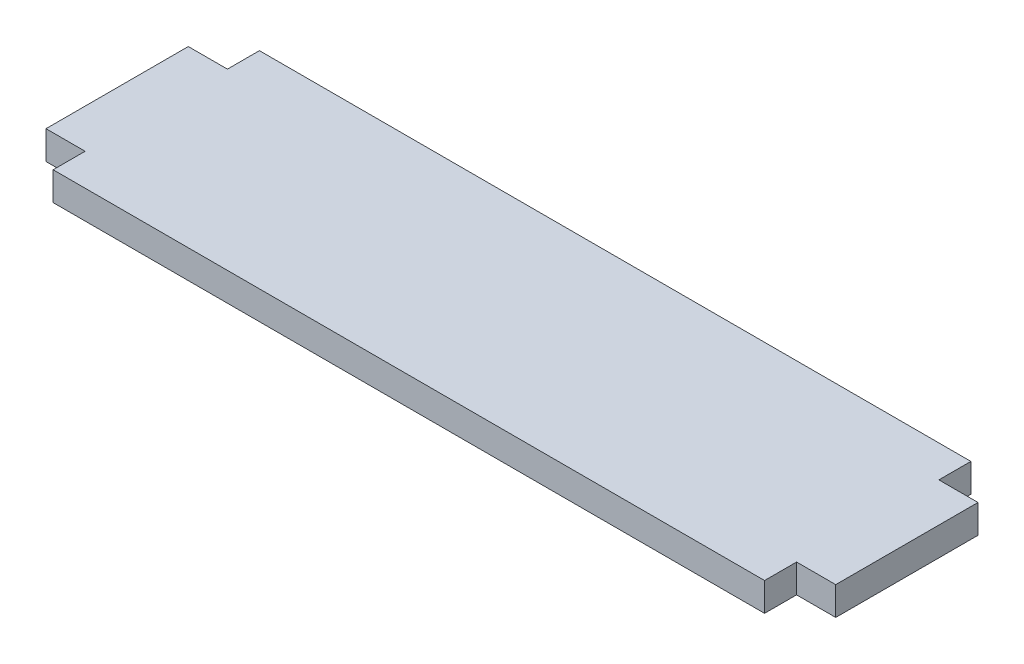
ISO-10303-21;
HEADER;
FILE_DESCRIPTION(('STEP AP214'),'2;1');
FILE_NAME('part.step','',(''),(''),'','','');
FILE_SCHEMA(('AUTOMOTIVE_DESIGN { 1 0 10303 214 1 1 1 1 }'));
ENDSEC;
DATA;
#1=APPLICATION_CONTEXT('core data for automotive mechanical design processes');
#2=APPLICATION_PROTOCOL_DEFINITION('international standard','automotive_design',2000,#1);
#3=PRODUCT_CONTEXT('',#1,'mechanical');
#4=PRODUCT('Part','Part','',(#3));
#5=PRODUCT_RELATED_PRODUCT_CATEGORY('part','',(#4));
#6=PRODUCT_DEFINITION_FORMATION('','',#4);
#7=PRODUCT_DEFINITION_CONTEXT('part definition',#1,'design');
#8=PRODUCT_DEFINITION('design','',#6,#7);
#9=PRODUCT_DEFINITION_SHAPE('','',#8);
#10=(LENGTH_UNIT() NAMED_UNIT(*) SI_UNIT(.MILLI.,.METRE.));
#11=(NAMED_UNIT(*) PLANE_ANGLE_UNIT() SI_UNIT($,.RADIAN.));
#12=(NAMED_UNIT(*) SI_UNIT($,.STERADIAN.) SOLID_ANGLE_UNIT());
#13=UNCERTAINTY_MEASURE_WITH_UNIT(LENGTH_MEASURE(1.E-05),#10,'distance_accuracy_value','');
#14=(GEOMETRIC_REPRESENTATION_CONTEXT(3) GLOBAL_UNCERTAINTY_ASSIGNED_CONTEXT((#13)) GLOBAL_UNIT_ASSIGNED_CONTEXT((#10,
#11,#12)) REPRESENTATION_CONTEXT('',''));
#15=CARTESIAN_POINT('',(0.,0.,0.));
#16=DIRECTION('',(0.,0.,1.));
#17=DIRECTION('',(1.,0.,0.));
#18=AXIS2_PLACEMENT_3D('',#15,#16,#17);
#19=CARTESIAN_POINT('',(-49.9999888700121,4.,14.4984944243489));
#20=DIRECTION('',(1.,0.,0.));
#21=DIRECTION('',(0.,0.,-1.));
#22=AXIS2_PLACEMENT_3D('',#19,#20,#21);
#23=PLANE('',#22);
#24=DIRECTION('',(0.,0.,1.));
#25=VECTOR('',#24,1.);
#26=CARTESIAN_POINT('',(-49.9999888700121,0.,14.4984944243489));
#27=LINE('',#26,#25);
#28=CARTESIAN_POINT('',(-49.9999888700121,0.,-14.4984944243489));
#29=VERTEX_POINT('',#28);
#30=CARTESIAN_POINT('',(-49.9999888700121,0.,-10.));
#31=VERTEX_POINT('',#30);
#32=EDGE_CURVE('E207',#29,#31,#27,.T.);
#33=ORIENTED_EDGE('',*,*,#32,.T.);
#34=DIRECTION('',(0.,1.,0.));
#35=VECTOR('',#34,1.);
#36=CARTESIAN_POINT('',(-49.9999888700121,4.,-10.));
#37=LINE('',#36,#35);
#38=CARTESIAN_POINT('',(-49.9999888700121,4.,-10.));
#39=VERTEX_POINT('',#38);
#40=EDGE_CURVE('E133',#31,#39,#37,.T.);
#41=ORIENTED_EDGE('',*,*,#40,.T.);
#42=DIRECTION('',(0.,0.,1.));
#43=VECTOR('',#42,1.);
#44=CARTESIAN_POINT('',(-49.9999888700121,4.,14.4984944243489));
#45=LINE('',#44,#43);
#46=CARTESIAN_POINT('',(-49.9999888700121,4.,-14.4984944243489));
#47=VERTEX_POINT('',#46);
#48=EDGE_CURVE('E177',#47,#39,#45,.T.);
#49=ORIENTED_EDGE('',*,*,#48,.F.);
#50=DIRECTION('',(0.,-1.,0.));
#51=VECTOR('',#50,1.);
#52=CARTESIAN_POINT('',(-49.9999888700121,4.,-14.4984944243489));
#53=LINE('',#52,#51);
#54=EDGE_CURVE('E44',#47,#29,#53,.T.);
#55=ORIENTED_EDGE('',*,*,#54,.T.);
#56=EDGE_LOOP('',(#33,#41,#49,#55));
#57=FACE_BOUND('',#56,.T.);
#58=ADVANCED_FACE('F35',(#57),#23,.F.);
#59=CARTESIAN_POINT('',(49.9999888700121,4.,14.4984944243489));
#60=DIRECTION('',(-1.,0.,0.));
#61=DIRECTION('',(0.,0.,1.));
#62=AXIS2_PLACEMENT_3D('',#59,#60,#61);
#63=PLANE('',#62);
#64=DIRECTION('',(0.,1.,0.));
#65=VECTOR('',#64,1.);
#66=CARTESIAN_POINT('',(49.9999888700121,4.,-10.));
#67=LINE('',#66,#65);
#68=CARTESIAN_POINT('',(49.9999888700121,0.,-10.));
#69=VERTEX_POINT('',#68);
#70=CARTESIAN_POINT('',(49.9999888700121,4.,-10.));
#71=VERTEX_POINT('',#70);
#72=EDGE_CURVE('E138',#69,#71,#67,.T.);
#73=ORIENTED_EDGE('',*,*,#72,.F.);
#74=DIRECTION('',(0.,0.,-1.));
#75=VECTOR('',#74,1.);
#76=CARTESIAN_POINT('',(49.9999888700121,0.,14.4984944243489));
#77=LINE('',#76,#75);
#78=CARTESIAN_POINT('',(49.9999888700121,0.,-14.4984944243489));
#79=VERTEX_POINT('',#78);
#80=EDGE_CURVE('E194',#69,#79,#77,.T.);
#81=ORIENTED_EDGE('',*,*,#80,.T.);
#82=DIRECTION('',(0.,-1.,0.));
#83=VECTOR('',#82,1.);
#84=CARTESIAN_POINT('',(49.9999888700121,4.,-14.4984944243489));
#85=LINE('',#84,#83);
#86=CARTESIAN_POINT('',(49.9999888700121,4.,-14.4984944243489));
#87=VERTEX_POINT('',#86);
#88=EDGE_CURVE('E11',#87,#79,#85,.T.);
#89=ORIENTED_EDGE('',*,*,#88,.F.);
#90=DIRECTION('',(0.,0.,-1.));
#91=VECTOR('',#90,1.);
#92=CARTESIAN_POINT('',(49.9999888700121,4.,14.4984944243489));
#93=LINE('',#92,#91);
#94=EDGE_CURVE('E60',#71,#87,#93,.T.);
#95=ORIENTED_EDGE('',*,*,#94,.F.);
#96=EDGE_LOOP('',(#73,#81,#89,#95));
#97=FACE_BOUND('',#96,.T.);
#98=ADVANCED_FACE('F37',(#97),#63,.F.);
#99=DIRECTION('',(0.,-1.,0.));
#100=VECTOR('',#99,1.);
#101=CARTESIAN_POINT('',(49.9999888700121,4.,9.99999999999999));
#102=LINE('',#101,#100);
#103=CARTESIAN_POINT('',(49.9999888700121,4.,9.99999999999999));
#104=VERTEX_POINT('',#103);
#105=CARTESIAN_POINT('',(49.9999888700121,0.,9.99999999999999));
#106=VERTEX_POINT('',#105);
#107=EDGE_CURVE('E223',#104,#106,#102,.T.);
#108=ORIENTED_EDGE('',*,*,#107,.F.);
#109=CARTESIAN_POINT('',(49.9999888700121,4.,14.4984944243489));
#110=VERTEX_POINT('',#109);
#111=EDGE_CURVE('E257',#110,#104,#93,.T.);
#112=ORIENTED_EDGE('',*,*,#111,.F.);
#113=DIRECTION('',(0.,-1.,0.));
#114=VECTOR('',#113,1.);
#115=CARTESIAN_POINT('',(49.9999888700121,4.,14.4984944243489));
#116=LINE('',#115,#114);
#117=CARTESIAN_POINT('',(49.9999888700121,0.,14.4984944243489));
#118=VERTEX_POINT('',#117);
#119=EDGE_CURVE('E187',#110,#118,#116,.T.);
#120=ORIENTED_EDGE('',*,*,#119,.T.);
#121=EDGE_CURVE('E197',#118,#106,#77,.T.);
#122=ORIENTED_EDGE('',*,*,#121,.T.);
#123=EDGE_LOOP('',(#108,#112,#120,#122));
#124=FACE_BOUND('',#123,.T.);
#125=ADVANCED_FACE('F281',(#124),#63,.F.);
#126=CARTESIAN_POINT('',(-49.9999888700121,4.,-14.4984944243489));
#127=DIRECTION('',(0.,0.,1.));
#128=DIRECTION('',(1.,0.,0.));
#129=AXIS2_PLACEMENT_3D('',#126,#127,#128);
#130=PLANE('',#129);
#131=DIRECTION('',(-1.,0.,0.));
#132=VECTOR('',#131,1.);
#133=CARTESIAN_POINT('',(-49.9999888700121,0.,-14.4984944243489));
#134=LINE('',#133,#132);
#135=EDGE_CURVE('E190',#79,#29,#134,.T.);
#136=ORIENTED_EDGE('',*,*,#135,.T.);
#137=ORIENTED_EDGE('',*,*,#54,.F.);
#138=DIRECTION('',(-1.,0.,0.));
#139=VECTOR('',#138,1.);
#140=CARTESIAN_POINT('',(-49.9999888700121,4.,-14.4984944243489));
#141=LINE('',#140,#139);
#142=EDGE_CURVE('E178',#87,#47,#141,.T.);
#143=ORIENTED_EDGE('',*,*,#142,.F.);
#144=ORIENTED_EDGE('',*,*,#88,.T.);
#145=EDGE_LOOP('',(#136,#137,#143,#144));
#146=FACE_BOUND('',#145,.T.);
#147=ADVANCED_FACE('F254',(#146),#130,.F.);
#148=CARTESIAN_POINT('',(-49.9999888700121,4.,9.99999999999999));
#149=VERTEX_POINT('',#148);
#150=CARTESIAN_POINT('',(-49.9999888700121,4.,14.4984944243489));
#151=VERTEX_POINT('',#150);
#152=EDGE_CURVE('E174',#149,#151,#45,.T.);
#153=ORIENTED_EDGE('',*,*,#152,.F.);
#154=DIRECTION('',(0.,-1.,0.));
#155=VECTOR('',#154,1.);
#156=CARTESIAN_POINT('',(-49.9999888700121,4.,9.99999999999999));
#157=LINE('',#156,#155);
#158=CARTESIAN_POINT('',(-49.9999888700121,0.,9.99999999999999));
#159=VERTEX_POINT('',#158);
#160=EDGE_CURVE('E146',#149,#159,#157,.T.);
#161=ORIENTED_EDGE('',*,*,#160,.T.);
#162=CARTESIAN_POINT('',(-49.9999888700121,0.,14.4984944243489));
#163=VERTEX_POINT('',#162);
#164=EDGE_CURVE('E210',#159,#163,#27,.T.);
#165=ORIENTED_EDGE('',*,*,#164,.T.);
#166=DIRECTION('',(0.,-1.,0.));
#167=VECTOR('',#166,1.);
#168=CARTESIAN_POINT('',(-49.9999888700121,4.,14.4984944243489));
#169=LINE('',#168,#167);
#170=EDGE_CURVE('E201',#151,#163,#169,.T.);
#171=ORIENTED_EDGE('',*,*,#170,.F.);
#172=EDGE_LOOP('',(#153,#161,#165,#171));
#173=FACE_BOUND('',#172,.T.);
#174=ADVANCED_FACE('F271',(#173),#23,.F.);
#175=CARTESIAN_POINT('',(-49.9999888700121,4.,14.4984944243489));
#176=DIRECTION('',(0.,0.,-1.));
#177=DIRECTION('',(-1.,0.,0.));
#178=AXIS2_PLACEMENT_3D('',#175,#176,#177);
#179=PLANE('',#178);
#180=DIRECTION('',(1.,0.,0.));
#181=VECTOR('',#180,1.);
#182=CARTESIAN_POINT('',(-49.9999888700121,0.,14.4984944243489));
#183=LINE('',#182,#181);
#184=EDGE_CURVE('E206',#163,#118,#183,.T.);
#185=ORIENTED_EDGE('',*,*,#184,.T.);
#186=ORIENTED_EDGE('',*,*,#119,.F.);
#187=DIRECTION('',(1.,0.,0.));
#188=VECTOR('',#187,1.);
#189=CARTESIAN_POINT('',(-49.9999888700121,4.,14.4984944243489));
#190=LINE('',#189,#188);
#191=EDGE_CURVE('E184',#151,#110,#190,.T.);
#192=ORIENTED_EDGE('',*,*,#191,.F.);
#193=ORIENTED_EDGE('',*,*,#170,.T.);
#194=EDGE_LOOP('',(#185,#186,#192,#193));
#195=FACE_BOUND('',#194,.T.);
#196=ADVANCED_FACE('F263',(#195),#179,.F.);
#197=CARTESIAN_POINT('',(0.,4.,0.));
#198=DIRECTION('',(0.,-1.,0.));
#199=DIRECTION('',(0.,0.,-1.));
#200=AXIS2_PLACEMENT_3D('',#197,#198,#199);
#201=PLANE('',#200);
#202=ORIENTED_EDGE('',*,*,#111,.T.);
#203=DIRECTION('',(-1.,0.,0.));
#204=VECTOR('',#203,1.);
#205=CARTESIAN_POINT('',(55.4999888700121,4.,9.99999999999999));
#206=LINE('',#205,#204);
#207=CARTESIAN_POINT('',(55.4999888700121,4.,9.99999999999999));
#208=VERTEX_POINT('',#207);
#209=EDGE_CURVE('E239',#208,#104,#206,.T.);
#210=ORIENTED_EDGE('',*,*,#209,.F.);
#211=DIRECTION('',(0.,0.,1.));
#212=VECTOR('',#211,1.);
#213=CARTESIAN_POINT('',(55.4999888700121,4.,9.99999999999999));
#214=LINE('',#213,#212);
#215=CARTESIAN_POINT('',(55.4999888700121,4.,-10.));
#216=VERTEX_POINT('',#215);
#217=EDGE_CURVE('E317',#216,#208,#214,.T.);
#218=ORIENTED_EDGE('',*,*,#217,.F.);
#219=DIRECTION('',(-1.,0.,0.));
#220=VECTOR('',#219,1.);
#221=CARTESIAN_POINT('',(55.4999888700121,4.,-10.));
#222=LINE('',#221,#220);
#223=EDGE_CURVE('E244',#216,#71,#222,.T.);
#224=ORIENTED_EDGE('',*,*,#223,.T.);
#225=ORIENTED_EDGE('',*,*,#94,.T.);
#226=ORIENTED_EDGE('',*,*,#142,.T.);
#227=ORIENTED_EDGE('',*,*,#48,.T.);
#228=DIRECTION('',(1.,0.,0.));
#229=VECTOR('',#228,1.);
#230=CARTESIAN_POINT('',(-55.4999888700121,4.,-10.));
#231=LINE('',#230,#229);
#232=CARTESIAN_POINT('',(-55.4999888700121,4.,-10.));
#233=VERTEX_POINT('',#232);
#234=EDGE_CURVE('E156',#233,#39,#231,.T.);
#235=ORIENTED_EDGE('',*,*,#234,.F.);
#236=DIRECTION('',(0.,0.,1.));
#237=VECTOR('',#236,1.);
#238=CARTESIAN_POINT('',(-55.4999888700121,4.,9.99999999999999));
#239=LINE('',#238,#237);
#240=CARTESIAN_POINT('',(-55.4999888700121,4.,9.99999999999999));
#241=VERTEX_POINT('',#240);
#242=EDGE_CURVE('E145',#233,#241,#239,.T.);
#243=ORIENTED_EDGE('',*,*,#242,.T.);
#244=DIRECTION('',(1.,0.,0.));
#245=VECTOR('',#244,1.);
#246=CARTESIAN_POINT('',(-55.4999888700121,4.,9.99999999999999));
#247=LINE('',#246,#245);
#248=EDGE_CURVE('E166',#241,#149,#247,.T.);
#249=ORIENTED_EDGE('',*,*,#248,.T.);
#250=ORIENTED_EDGE('',*,*,#152,.T.);
#251=ORIENTED_EDGE('',*,*,#191,.T.);
#252=EDGE_LOOP('',(#202,#210,#218,#224,#225,#226,#227,#235,#243,#249,#250,#251));
#253=FACE_BOUND('',#252,.T.);
#254=ADVANCED_FACE('F261',(#253),#201,.F.);
#255=CARTESIAN_POINT('',(0.,0.,0.));
#256=DIRECTION('',(0.,-1.,0.));
#257=DIRECTION('',(0.,0.,-1.));
#258=AXIS2_PLACEMENT_3D('',#255,#256,#257);
#259=PLANE('',#258);
#260=ORIENTED_EDGE('',*,*,#121,.F.);
#261=ORIENTED_EDGE('',*,*,#184,.F.);
#262=ORIENTED_EDGE('',*,*,#164,.F.);
#263=DIRECTION('',(1.,0.,0.));
#264=VECTOR('',#263,1.);
#265=CARTESIAN_POINT('',(-55.4999888700121,0.,9.99999999999999));
#266=LINE('',#265,#264);
#267=CARTESIAN_POINT('',(-55.4999888700121,0.,9.99999999999999));
#268=VERTEX_POINT('',#267);
#269=EDGE_CURVE('E52',#268,#159,#266,.T.);
#270=ORIENTED_EDGE('',*,*,#269,.F.);
#271=DIRECTION('',(0.,0.,-1.));
#272=VECTOR('',#271,1.);
#273=CARTESIAN_POINT('',(-55.4999888700121,0.,9.99999999999999));
#274=LINE('',#273,#272);
#275=CARTESIAN_POINT('',(-55.4999888700121,0.,-10.));
#276=VERTEX_POINT('',#275);
#277=EDGE_CURVE('E143',#268,#276,#274,.T.);
#278=ORIENTED_EDGE('',*,*,#277,.T.);
#279=DIRECTION('',(1.,0.,0.));
#280=VECTOR('',#279,1.);
#281=CARTESIAN_POINT('',(-55.4999888700121,0.,-10.));
#282=LINE('',#281,#280);
#283=EDGE_CURVE('E127',#276,#31,#282,.T.);
#284=ORIENTED_EDGE('',*,*,#283,.T.);
#285=ORIENTED_EDGE('',*,*,#32,.F.);
#286=ORIENTED_EDGE('',*,*,#135,.F.);
#287=ORIENTED_EDGE('',*,*,#80,.F.);
#288=DIRECTION('',(-1.,0.,0.));
#289=VECTOR('',#288,1.);
#290=CARTESIAN_POINT('',(55.4999888700121,0.,-10.));
#291=LINE('',#290,#289);
#292=CARTESIAN_POINT('',(55.4999888700121,0.,-10.));
#293=VERTEX_POINT('',#292);
#294=EDGE_CURVE('E215',#293,#69,#291,.T.);
#295=ORIENTED_EDGE('',*,*,#294,.F.);
#296=DIRECTION('',(0.,0.,-1.));
#297=VECTOR('',#296,1.);
#298=CARTESIAN_POINT('',(55.4999888700121,0.,9.99999999999999));
#299=LINE('',#298,#297);
#300=CARTESIAN_POINT('',(55.4999888700121,0.,9.99999999999999));
#301=VERTEX_POINT('',#300);
#302=EDGE_CURVE('E219',#301,#293,#299,.T.);
#303=ORIENTED_EDGE('',*,*,#302,.F.);
#304=DIRECTION('',(-1.,0.,0.));
#305=VECTOR('',#304,1.);
#306=CARTESIAN_POINT('',(55.4999888700121,0.,9.99999999999999));
#307=LINE('',#306,#305);
#308=EDGE_CURVE('E218',#301,#106,#307,.T.);
#309=ORIENTED_EDGE('',*,*,#308,.T.);
#310=EDGE_LOOP('',(#260,#261,#262,#270,#278,#284,#285,#286,#287,#295,#303,#309));
#311=FACE_BOUND('',#310,.T.);
#312=ADVANCED_FACE('F149',(#311),#259,.T.);
#313=CARTESIAN_POINT('',(55.4999888700121,4.,-10.));
#314=DIRECTION('',(0.,0.,1.));
#315=DIRECTION('',(1.,0.,0.));
#316=AXIS2_PLACEMENT_3D('',#313,#314,#315);
#317=PLANE('',#316);
#318=ORIENTED_EDGE('',*,*,#72,.T.);
#319=ORIENTED_EDGE('',*,*,#223,.F.);
#320=DIRECTION('',(0.,1.,0.));
#321=VECTOR('',#320,1.);
#322=CARTESIAN_POINT('',(55.4999888700121,4.,-10.));
#323=LINE('',#322,#321);
#324=EDGE_CURVE('E236',#293,#216,#323,.T.);
#325=ORIENTED_EDGE('',*,*,#324,.F.);
#326=ORIENTED_EDGE('',*,*,#294,.T.);
#327=EDGE_LOOP('',(#318,#319,#325,#326));
#328=FACE_BOUND('',#327,.T.);
#329=ADVANCED_FACE('F269',(#328),#317,.F.);
#330=CARTESIAN_POINT('',(55.4999888700121,4.,9.99999999999999));
#331=DIRECTION('',(0.,0.,-1.));
#332=DIRECTION('',(-1.,0.,0.));
#333=AXIS2_PLACEMENT_3D('',#330,#331,#332);
#334=PLANE('',#333);
#335=ORIENTED_EDGE('',*,*,#107,.T.);
#336=ORIENTED_EDGE('',*,*,#308,.F.);
#337=DIRECTION('',(0.,-1.,0.));
#338=VECTOR('',#337,1.);
#339=CARTESIAN_POINT('',(55.4999888700121,4.,9.99999999999999));
#340=LINE('',#339,#338);
#341=EDGE_CURVE('E316',#208,#301,#340,.T.);
#342=ORIENTED_EDGE('',*,*,#341,.F.);
#343=ORIENTED_EDGE('',*,*,#209,.T.);
#344=EDGE_LOOP('',(#335,#336,#342,#343));
#345=FACE_BOUND('',#344,.T.);
#346=ADVANCED_FACE('F304',(#345),#334,.F.);
#347=CARTESIAN_POINT('',(55.4999888700121,0.,0.));
#348=DIRECTION('',(1.,0.,0.));
#349=DIRECTION('',(0.,0.,-1.));
#350=AXIS2_PLACEMENT_3D('',#347,#348,#349);
#351=PLANE('',#350);
#352=ORIENTED_EDGE('',*,*,#324,.T.);
#353=ORIENTED_EDGE('',*,*,#217,.T.);
#354=ORIENTED_EDGE('',*,*,#341,.T.);
#355=ORIENTED_EDGE('',*,*,#302,.T.);
#356=EDGE_LOOP('',(#352,#353,#354,#355));
#357=FACE_BOUND('',#356,.T.);
#358=ADVANCED_FACE('F299',(#357),#351,.T.);
#359=CARTESIAN_POINT('',(-55.4999888700121,4.,-10.));
#360=DIRECTION('',(0.,0.,-1.));
#361=DIRECTION('',(-1.,0.,0.));
#362=AXIS2_PLACEMENT_3D('',#359,#360,#361);
#363=PLANE('',#362);
#364=ORIENTED_EDGE('',*,*,#40,.F.);
#365=ORIENTED_EDGE('',*,*,#283,.F.);
#366=DIRECTION('',(0.,1.,0.));
#367=VECTOR('',#366,1.);
#368=CARTESIAN_POINT('',(-55.4999888700121,4.,-10.));
#369=LINE('',#368,#367);
#370=EDGE_CURVE('E130',#276,#233,#369,.T.);
#371=ORIENTED_EDGE('',*,*,#370,.T.);
#372=ORIENTED_EDGE('',*,*,#234,.T.);
#373=EDGE_LOOP('',(#364,#365,#371,#372));
#374=FACE_BOUND('',#373,.T.);
#375=ADVANCED_FACE('F129',(#374),#363,.T.);
#376=CARTESIAN_POINT('',(-55.4999888700121,4.,9.99999999999999));
#377=DIRECTION('',(0.,0.,1.));
#378=DIRECTION('',(1.,0.,0.));
#379=AXIS2_PLACEMENT_3D('',#376,#377,#378);
#380=PLANE('',#379);
#381=ORIENTED_EDGE('',*,*,#160,.F.);
#382=ORIENTED_EDGE('',*,*,#248,.F.);
#383=DIRECTION('',(0.,-1.,0.));
#384=VECTOR('',#383,1.);
#385=CARTESIAN_POINT('',(-55.4999888700121,4.,9.99999999999999));
#386=LINE('',#385,#384);
#387=EDGE_CURVE('E151',#241,#268,#386,.T.);
#388=ORIENTED_EDGE('',*,*,#387,.T.);
#389=ORIENTED_EDGE('',*,*,#269,.T.);
#390=EDGE_LOOP('',(#381,#382,#388,#389));
#391=FACE_BOUND('',#390,.T.);
#392=ADVANCED_FACE('F291',(#391),#380,.T.);
#393=CARTESIAN_POINT('',(-55.4999888700121,0.,0.));
#394=DIRECTION('',(-1.,0.,0.));
#395=DIRECTION('',(0.,0.,-1.));
#396=AXIS2_PLACEMENT_3D('',#393,#394,#395);
#397=PLANE('',#396);
#398=ORIENTED_EDGE('',*,*,#370,.F.);
#399=ORIENTED_EDGE('',*,*,#277,.F.);
#400=ORIENTED_EDGE('',*,*,#387,.F.);
#401=ORIENTED_EDGE('',*,*,#242,.F.);
#402=EDGE_LOOP('',(#398,#399,#400,#401));
#403=FACE_BOUND('',#402,.T.);
#404=ADVANCED_FACE('F141',(#403),#397,.T.);
#405=CLOSED_SHELL('',(#58,#98,#125,#147,#174,#196,#254,#312,#329,#346,#358,#375,#392,#404));
#406=MANIFOLD_SOLID_BREP('B2',#405);
#407=ADVANCED_BREP_SHAPE_REPRESENTATION('',(#18,#406),#14);
#408=SHAPE_DEFINITION_REPRESENTATION(#9,#407);
ENDSEC;
END-ISO-10303-21;
